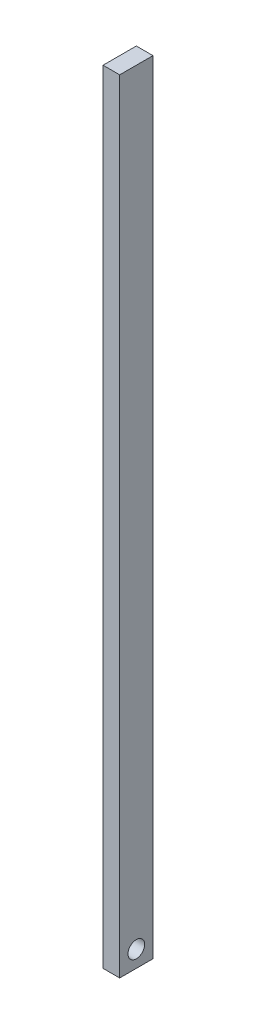
ISO-10303-21;
HEADER;
FILE_DESCRIPTION(('STEP AP214'),'2;1');
FILE_NAME('part.step','',(''),(''),'','','');
FILE_SCHEMA(('AUTOMOTIVE_DESIGN { 1 0 10303 214 1 1 1 1 }'));
ENDSEC;
DATA;
#1=APPLICATION_CONTEXT('core data for automotive mechanical design processes');
#2=APPLICATION_PROTOCOL_DEFINITION('international standard','automotive_design',2000,#1);
#3=PRODUCT_CONTEXT('',#1,'mechanical');
#4=PRODUCT('Part','Part','',(#3));
#5=PRODUCT_RELATED_PRODUCT_CATEGORY('part','',(#4));
#6=PRODUCT_DEFINITION_FORMATION('','',#4);
#7=PRODUCT_DEFINITION_CONTEXT('part definition',#1,'design');
#8=PRODUCT_DEFINITION('design','',#6,#7);
#9=PRODUCT_DEFINITION_SHAPE('','',#8);
#10=(LENGTH_UNIT() NAMED_UNIT(*) SI_UNIT(.MILLI.,.METRE.));
#11=(NAMED_UNIT(*) PLANE_ANGLE_UNIT() SI_UNIT($,.RADIAN.));
#12=(NAMED_UNIT(*) SI_UNIT($,.STERADIAN.) SOLID_ANGLE_UNIT());
#13=UNCERTAINTY_MEASURE_WITH_UNIT(LENGTH_MEASURE(1.E-05),#10,'distance_accuracy_value','');
#14=(GEOMETRIC_REPRESENTATION_CONTEXT(3) GLOBAL_UNCERTAINTY_ASSIGNED_CONTEXT((#13)) GLOBAL_UNIT_ASSIGNED_CONTEXT((#10,
#11,#12)) REPRESENTATION_CONTEXT('',''));
#15=CARTESIAN_POINT('',(0.,0.,0.));
#16=DIRECTION('',(0.,0.,1.));
#17=DIRECTION('',(1.,0.,0.));
#18=AXIS2_PLACEMENT_3D('',#15,#16,#17);
#19=CARTESIAN_POINT('',(0.,1193.8,0.));
#20=DIRECTION('',(1.,0.,0.));
#21=DIRECTION('',(0.,0.,-1.));
#22=AXIS2_PLACEMENT_3D('',#19,#20,#21);
#23=PLANE('',#22);
#24=CARTESIAN_POINT('',(0.,25.4,-25.4));
#25=DIRECTION('',(1.,0.,0.));
#26=DIRECTION('',(0.,0.,-1.));
#27=AXIS2_PLACEMENT_3D('',#24,#25,#26);
#28=CIRCLE('',#27,12.7);
#29=CARTESIAN_POINT('',(0.,25.4,-38.1));
#30=VERTEX_POINT('',#29);
#31=EDGE_CURVE('E99',#30,#30,#28,.T.);
#32=ORIENTED_EDGE('',*,*,#31,.T.);
#33=EDGE_LOOP('',(#32));
#34=FACE_BOUND('',#33,.T.);
#35=DIRECTION('',(0.,0.,1.));
#36=VECTOR('',#35,1.);
#37=CARTESIAN_POINT('',(0.,0.,0.));
#38=LINE('',#37,#36);
#39=CARTESIAN_POINT('',(0.,0.,-50.8));
#40=VERTEX_POINT('',#39);
#41=CARTESIAN_POINT('',(0.,0.,0.));
#42=VERTEX_POINT('',#41);
#43=EDGE_CURVE('E96',#40,#42,#38,.T.);
#44=ORIENTED_EDGE('',*,*,#43,.T.);
#45=DIRECTION('',(0.,-1.,0.));
#46=VECTOR('',#45,1.);
#47=CARTESIAN_POINT('',(0.,1193.8,0.));
#48=LINE('',#47,#46);
#49=CARTESIAN_POINT('',(0.,1193.8,0.));
#50=VERTEX_POINT('',#49);
#51=EDGE_CURVE('E11',#50,#42,#48,.T.);
#52=ORIENTED_EDGE('',*,*,#51,.F.);
#53=DIRECTION('',(0.,0.,1.));
#54=VECTOR('',#53,1.);
#55=CARTESIAN_POINT('',(0.,1193.8,0.));
#56=LINE('',#55,#54);
#57=CARTESIAN_POINT('',(0.,1193.8,-50.8));
#58=VERTEX_POINT('',#57);
#59=EDGE_CURVE('E84',#58,#50,#56,.T.);
#60=ORIENTED_EDGE('',*,*,#59,.F.);
#61=DIRECTION('',(0.,-1.,0.));
#62=VECTOR('',#61,1.);
#63=CARTESIAN_POINT('',(0.,1193.8,-50.8));
#64=LINE('',#63,#62);
#65=EDGE_CURVE('E92',#58,#40,#64,.T.);
#66=ORIENTED_EDGE('',*,*,#65,.T.);
#67=EDGE_LOOP('',(#44,#52,#60,#66));
#68=FACE_BOUND('',#67,.T.);
#69=ADVANCED_FACE('F33',(#34,#68),#23,.F.);
#70=CARTESIAN_POINT('',(0.,1193.8,0.));
#71=DIRECTION('',(0.,0.,-1.));
#72=DIRECTION('',(-1.,0.,0.));
#73=AXIS2_PLACEMENT_3D('',#70,#71,#72);
#74=PLANE('',#73);
#75=DIRECTION('',(1.,0.,0.));
#76=VECTOR('',#75,1.);
#77=CARTESIAN_POINT('',(0.,0.,0.));
#78=LINE('',#77,#76);
#79=CARTESIAN_POINT('',(25.4,0.,0.));
#80=VERTEX_POINT('',#79);
#81=EDGE_CURVE('E88',#42,#80,#78,.T.);
#82=ORIENTED_EDGE('',*,*,#81,.T.);
#83=DIRECTION('',(0.,-1.,0.));
#84=VECTOR('',#83,1.);
#85=CARTESIAN_POINT('',(25.4,1193.8,0.));
#86=LINE('',#85,#84);
#87=CARTESIAN_POINT('',(25.4,1193.8,0.));
#88=VERTEX_POINT('',#87);
#89=EDGE_CURVE('E41',#88,#80,#86,.T.);
#90=ORIENTED_EDGE('',*,*,#89,.F.);
#91=DIRECTION('',(1.,0.,0.));
#92=VECTOR('',#91,1.);
#93=CARTESIAN_POINT('',(0.,1193.8,0.));
#94=LINE('',#93,#92);
#95=EDGE_CURVE('E79',#50,#88,#94,.T.);
#96=ORIENTED_EDGE('',*,*,#95,.F.);
#97=ORIENTED_EDGE('',*,*,#51,.T.);
#98=EDGE_LOOP('',(#82,#90,#96,#97));
#99=FACE_BOUND('',#98,.T.);
#100=ADVANCED_FACE('F87',(#99),#74,.F.);
#101=CARTESIAN_POINT('',(25.4,1193.8,0.));
#102=DIRECTION('',(-1.,0.,0.));
#103=DIRECTION('',(0.,0.,1.));
#104=AXIS2_PLACEMENT_3D('',#101,#102,#103);
#105=PLANE('',#104);
#106=CARTESIAN_POINT('',(25.4,25.4,-25.4));
#107=DIRECTION('',(1.,0.,0.));
#108=DIRECTION('',(0.,0.,-1.));
#109=AXIS2_PLACEMENT_3D('',#106,#107,#108);
#110=CIRCLE('',#109,12.7);
#111=CARTESIAN_POINT('',(25.4,25.4,-38.1));
#112=VERTEX_POINT('',#111);
#113=EDGE_CURVE('E112',#112,#112,#110,.T.);
#114=ORIENTED_EDGE('',*,*,#113,.F.);
#115=EDGE_LOOP('',(#114));
#116=FACE_BOUND('',#115,.T.);
#117=DIRECTION('',(0.,0.,-1.));
#118=VECTOR('',#117,1.);
#119=CARTESIAN_POINT('',(25.4,0.,0.));
#120=LINE('',#119,#118);
#121=CARTESIAN_POINT('',(25.4,0.,-50.8));
#122=VERTEX_POINT('',#121);
#123=EDGE_CURVE('E66',#80,#122,#120,.T.);
#124=ORIENTED_EDGE('',*,*,#123,.T.);
#125=DIRECTION('',(0.,-1.,0.));
#126=VECTOR('',#125,1.);
#127=CARTESIAN_POINT('',(25.4,1193.8,-50.8));
#128=LINE('',#127,#126);
#129=CARTESIAN_POINT('',(25.4,1193.8,-50.8));
#130=VERTEX_POINT('',#129);
#131=EDGE_CURVE('E89',#130,#122,#128,.T.);
#132=ORIENTED_EDGE('',*,*,#131,.F.);
#133=DIRECTION('',(0.,0.,-1.));
#134=VECTOR('',#133,1.);
#135=CARTESIAN_POINT('',(25.4,1193.8,0.));
#136=LINE('',#135,#134);
#137=EDGE_CURVE('E82',#88,#130,#136,.T.);
#138=ORIENTED_EDGE('',*,*,#137,.F.);
#139=ORIENTED_EDGE('',*,*,#89,.T.);
#140=EDGE_LOOP('',(#124,#132,#138,#139));
#141=FACE_BOUND('',#140,.T.);
#142=ADVANCED_FACE('F90',(#116,#141),#105,.F.);
#143=CARTESIAN_POINT('',(0.,1193.8,-50.8));
#144=DIRECTION('',(0.,0.,1.));
#145=DIRECTION('',(1.,0.,0.));
#146=AXIS2_PLACEMENT_3D('',#143,#144,#145);
#147=PLANE('',#146);
#148=DIRECTION('',(-1.,0.,0.));
#149=VECTOR('',#148,1.);
#150=CARTESIAN_POINT('',(0.,0.,-50.8));
#151=LINE('',#150,#149);
#152=EDGE_CURVE('E72',#122,#40,#151,.T.);
#153=ORIENTED_EDGE('',*,*,#152,.T.);
#154=ORIENTED_EDGE('',*,*,#65,.F.);
#155=DIRECTION('',(-1.,0.,0.));
#156=VECTOR('',#155,1.);
#157=CARTESIAN_POINT('',(0.,1193.8,-50.8));
#158=LINE('',#157,#156);
#159=EDGE_CURVE('E49',#130,#58,#158,.T.);
#160=ORIENTED_EDGE('',*,*,#159,.F.);
#161=ORIENTED_EDGE('',*,*,#131,.T.);
#162=EDGE_LOOP('',(#153,#154,#160,#161));
#163=FACE_BOUND('',#162,.T.);
#164=ADVANCED_FACE('F104',(#163),#147,.F.);
#165=CARTESIAN_POINT('',(0.,1193.8,0.));
#166=DIRECTION('',(0.,-1.,0.));
#167=DIRECTION('',(0.,0.,-1.));
#168=AXIS2_PLACEMENT_3D('',#165,#166,#167);
#169=PLANE('',#168);
#170=ORIENTED_EDGE('',*,*,#59,.T.);
#171=ORIENTED_EDGE('',*,*,#95,.T.);
#172=ORIENTED_EDGE('',*,*,#137,.T.);
#173=ORIENTED_EDGE('',*,*,#159,.T.);
#174=EDGE_LOOP('',(#170,#171,#172,#173));
#175=FACE_BOUND('',#174,.T.);
#176=ADVANCED_FACE('F80',(#175),#169,.F.);
#177=CARTESIAN_POINT('',(0.,0.,0.));
#178=DIRECTION('',(0.,-1.,0.));
#179=DIRECTION('',(0.,0.,-1.));
#180=AXIS2_PLACEMENT_3D('',#177,#178,#179);
#181=PLANE('',#180);
#182=ORIENTED_EDGE('',*,*,#43,.F.);
#183=ORIENTED_EDGE('',*,*,#152,.F.);
#184=ORIENTED_EDGE('',*,*,#123,.F.);
#185=ORIENTED_EDGE('',*,*,#81,.F.);
#186=EDGE_LOOP('',(#182,#183,#184,#185));
#187=FACE_BOUND('',#186,.T.);
#188=ADVANCED_FACE('F107',(#187),#181,.T.);
#189=CARTESIAN_POINT('',(-1168.4,25.4,-25.4));
#190=DIRECTION('',(1.,0.,0.));
#191=DIRECTION('',(0.,0.,-1.));
#192=AXIS2_PLACEMENT_3D('',#189,#190,#191);
#193=CYLINDRICAL_SURFACE('',#192,12.7);
#194=ORIENTED_EDGE('',*,*,#113,.T.);
#195=EDGE_LOOP('',(#194));
#196=FACE_BOUND('',#195,.T.);
#197=ORIENTED_EDGE('',*,*,#31,.F.);
#198=EDGE_LOOP('',(#197));
#199=FACE_BOUND('',#198,.T.);
#200=ADVANCED_FACE('F116',(#196,#199),#193,.F.);
#201=CLOSED_SHELL('',(#69,#100,#142,#164,#176,#188,#200));
#202=MANIFOLD_SOLID_BREP('B2',#201);
#203=ADVANCED_BREP_SHAPE_REPRESENTATION('',(#18,#202),#14);
#204=SHAPE_DEFINITION_REPRESENTATION(#9,#203);
ENDSEC;
END-ISO-10303-21;
